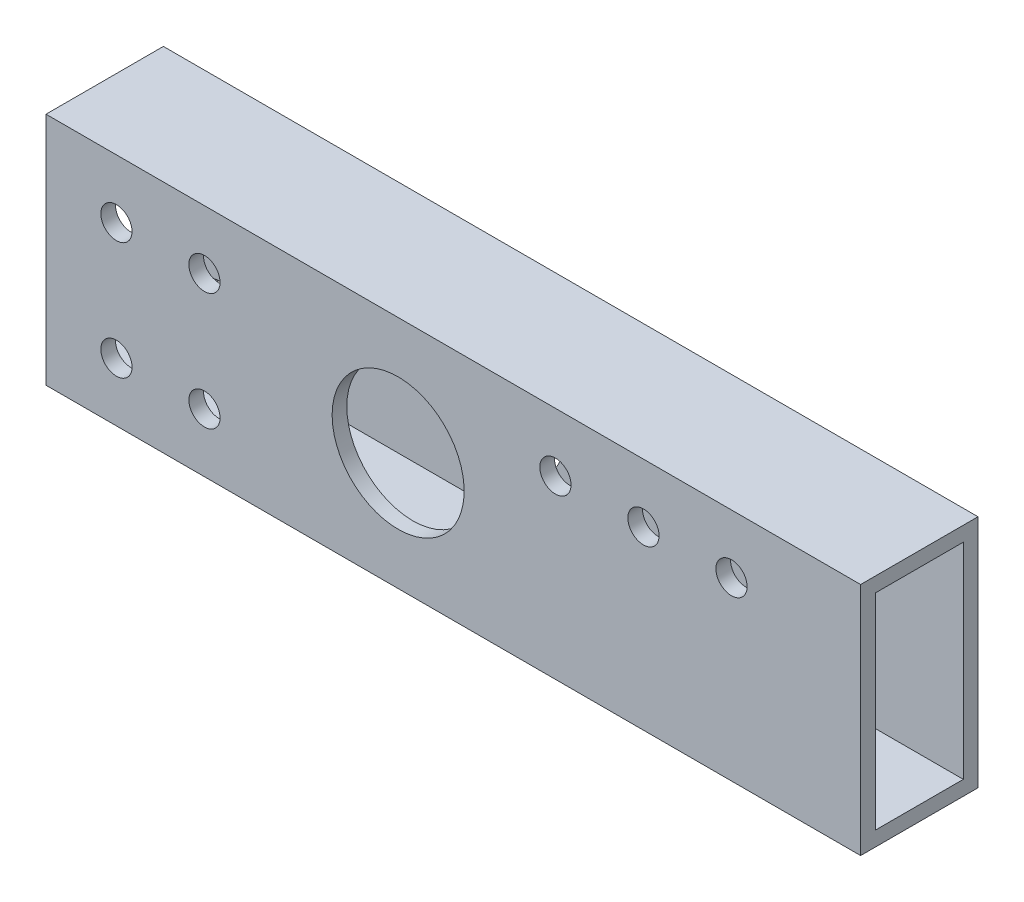
ISO-10303-21;
HEADER;
FILE_DESCRIPTION(('STEP AP214'),'2;1');
FILE_NAME('part.step','',(''),(''),'','','');
FILE_SCHEMA(('AUTOMOTIVE_DESIGN { 1 0 10303 214 1 1 1 1 }'));
ENDSEC;
DATA;
#1=APPLICATION_CONTEXT('core data for automotive mechanical design processes');
#2=APPLICATION_PROTOCOL_DEFINITION('international standard','automotive_design',2000,#1);
#3=PRODUCT_CONTEXT('',#1,'mechanical');
#4=PRODUCT('Part','Part','',(#3));
#5=PRODUCT_RELATED_PRODUCT_CATEGORY('part','',(#4));
#6=PRODUCT_DEFINITION_FORMATION('','',#4);
#7=PRODUCT_DEFINITION_CONTEXT('part definition',#1,'design');
#8=PRODUCT_DEFINITION('design','',#6,#7);
#9=PRODUCT_DEFINITION_SHAPE('','',#8);
#10=(LENGTH_UNIT() NAMED_UNIT(*) SI_UNIT(.MILLI.,.METRE.));
#11=(NAMED_UNIT(*) PLANE_ANGLE_UNIT() SI_UNIT($,.RADIAN.));
#12=(NAMED_UNIT(*) SI_UNIT($,.STERADIAN.) SOLID_ANGLE_UNIT());
#13=UNCERTAINTY_MEASURE_WITH_UNIT(LENGTH_MEASURE(1.E-05),#10,'distance_accuracy_value','');
#14=(GEOMETRIC_REPRESENTATION_CONTEXT(3) GLOBAL_UNCERTAINTY_ASSIGNED_CONTEXT((#13)) GLOBAL_UNIT_ASSIGNED_CONTEXT((#10,
#11,#12)) REPRESENTATION_CONTEXT('',''));
#15=CARTESIAN_POINT('',(0.,0.,0.));
#16=DIRECTION('',(0.,0.,1.));
#17=DIRECTION('',(1.,0.,0.));
#18=AXIS2_PLACEMENT_3D('',#15,#16,#17);
#19=CARTESIAN_POINT('',(0.,50.8,0.));
#20=DIRECTION('',(1.,0.,0.));
#21=DIRECTION('',(0.,0.,-1.));
#22=AXIS2_PLACEMENT_3D('',#19,#20,#21);
#23=PLANE('',#22);
#24=DIRECTION('',(0.,1.,0.));
#25=VECTOR('',#24,1.);
#26=CARTESIAN_POINT('',(0.,47.625,-22.225));
#27=LINE('',#26,#25);
#28=CARTESIAN_POINT('',(0.,3.175,-22.225));
#29=VERTEX_POINT('',#28);
#30=CARTESIAN_POINT('',(0.,47.625,-22.225));
#31=VERTEX_POINT('',#30);
#32=EDGE_CURVE('E108',#29,#31,#27,.T.);
#33=ORIENTED_EDGE('',*,*,#32,.T.);
#34=DIRECTION('',(0.,0.,1.));
#35=VECTOR('',#34,1.);
#36=CARTESIAN_POINT('',(0.,47.625,-3.175));
#37=LINE('',#36,#35);
#38=CARTESIAN_POINT('',(0.,47.625,-3.175));
#39=VERTEX_POINT('',#38);
#40=EDGE_CURVE('E102',#31,#39,#37,.T.);
#41=ORIENTED_EDGE('',*,*,#40,.T.);
#42=DIRECTION('',(0.,-1.,0.));
#43=VECTOR('',#42,1.);
#44=CARTESIAN_POINT('',(0.,47.625,-3.175));
#45=LINE('',#44,#43);
#46=CARTESIAN_POINT('',(0.,3.175,-3.175));
#47=VERTEX_POINT('',#46);
#48=EDGE_CURVE('E111',#39,#47,#45,.T.);
#49=ORIENTED_EDGE('',*,*,#48,.T.);
#50=DIRECTION('',(0.,0.,-1.));
#51=VECTOR('',#50,1.);
#52=CARTESIAN_POINT('',(0.,3.175,-3.175));
#53=LINE('',#52,#51);
#54=EDGE_CURVE('E50',#47,#29,#53,.T.);
#55=ORIENTED_EDGE('',*,*,#54,.T.);
#56=EDGE_LOOP('',(#33,#41,#49,#55));
#57=FACE_BOUND('',#56,.T.);
#58=DIRECTION('',(0.,0.,1.));
#59=VECTOR('',#58,1.);
#60=CARTESIAN_POINT('',(0.,0.,0.));
#61=LINE('',#60,#59);
#62=CARTESIAN_POINT('',(0.,0.,-25.4));
#63=VERTEX_POINT('',#62);
#64=CARTESIAN_POINT('',(0.,0.,0.));
#65=VERTEX_POINT('',#64);
#66=EDGE_CURVE('E135',#63,#65,#61,.T.);
#67=ORIENTED_EDGE('',*,*,#66,.T.);
#68=DIRECTION('',(0.,-1.,0.));
#69=VECTOR('',#68,1.);
#70=CARTESIAN_POINT('',(0.,50.8,0.));
#71=LINE('',#70,#69);
#72=CARTESIAN_POINT('',(0.,50.8,0.));
#73=VERTEX_POINT('',#72);
#74=EDGE_CURVE('E12',#73,#65,#71,.T.);
#75=ORIENTED_EDGE('',*,*,#74,.F.);
#76=DIRECTION('',(0.,0.,1.));
#77=VECTOR('',#76,1.);
#78=CARTESIAN_POINT('',(0.,50.8,0.));
#79=LINE('',#78,#77);
#80=CARTESIAN_POINT('',(0.,50.8,-25.4));
#81=VERTEX_POINT('',#80);
#82=EDGE_CURVE('E139',#81,#73,#79,.T.);
#83=ORIENTED_EDGE('',*,*,#82,.F.);
#84=DIRECTION('',(0.,-1.,0.));
#85=VECTOR('',#84,1.);
#86=CARTESIAN_POINT('',(0.,50.8,-25.4));
#87=LINE('',#86,#85);
#88=EDGE_CURVE('E149',#81,#63,#87,.T.);
#89=ORIENTED_EDGE('',*,*,#88,.T.);
#90=EDGE_LOOP('',(#67,#75,#83,#89));
#91=FACE_BOUND('',#90,.T.);
#92=ADVANCED_FACE('F34',(#57,#91),#23,.F.);
#93=CARTESIAN_POINT('',(0.,50.8,0.));
#94=DIRECTION('',(0.,0.,-1.));
#95=DIRECTION('',(-1.,0.,0.));
#96=AXIS2_PLACEMENT_3D('',#93,#94,#95);
#97=PLANE('',#96);
#98=CARTESIAN_POINT('',(34.29,38.1,0.));
#99=DIRECTION('',(0.,0.,1.));
#100=DIRECTION('',(1.,0.,0.));
#101=AXIS2_PLACEMENT_3D('',#98,#99,#100);
#102=CIRCLE('',#101,3.3782);
#103=CARTESIAN_POINT('',(37.6682,38.1,0.));
#104=VERTEX_POINT('',#103);
#105=EDGE_CURVE('E556',#104,#104,#102,.T.);
#106=ORIENTED_EDGE('',*,*,#105,.F.);
#107=EDGE_LOOP('',(#106));
#108=FACE_BOUND('',#107,.T.);
#109=CARTESIAN_POINT('',(34.29,12.7,0.));
#110=DIRECTION('',(0.,0.,1.));
#111=DIRECTION('',(1.,0.,0.));
#112=AXIS2_PLACEMENT_3D('',#109,#110,#111);
#113=CIRCLE('',#112,3.3782);
#114=CARTESIAN_POINT('',(37.6682,12.7,0.));
#115=VERTEX_POINT('',#114);
#116=EDGE_CURVE('E202',#115,#115,#113,.T.);
#117=ORIENTED_EDGE('',*,*,#116,.F.);
#118=EDGE_LOOP('',(#117));
#119=FACE_BOUND('',#118,.T.);
#120=CARTESIAN_POINT('',(15.24,12.7,0.));
#121=DIRECTION('',(0.,0.,1.));
#122=DIRECTION('',(1.,0.,0.));
#123=AXIS2_PLACEMENT_3D('',#120,#121,#122);
#124=CIRCLE('',#123,3.3782);
#125=CARTESIAN_POINT('',(18.6182,12.7,0.));
#126=VERTEX_POINT('',#125);
#127=EDGE_CURVE('E199',#126,#126,#124,.T.);
#128=ORIENTED_EDGE('',*,*,#127,.F.);
#129=EDGE_LOOP('',(#128));
#130=FACE_BOUND('',#129,.T.);
#131=CARTESIAN_POINT('',(15.24,38.1,0.));
#132=DIRECTION('',(0.,0.,1.));
#133=DIRECTION('',(1.,0.,0.));
#134=AXIS2_PLACEMENT_3D('',#131,#132,#133);
#135=CIRCLE('',#134,3.3782);
#136=CARTESIAN_POINT('',(18.6182,38.1,0.));
#137=VERTEX_POINT('',#136);
#138=EDGE_CURVE('E218',#137,#137,#135,.T.);
#139=ORIENTED_EDGE('',*,*,#138,.F.);
#140=EDGE_LOOP('',(#139));
#141=FACE_BOUND('',#140,.T.);
#142=CARTESIAN_POINT('',(110.236,38.1,0.));
#143=DIRECTION('',(0.,0.,1.));
#144=DIRECTION('',(1.,0.,0.));
#145=AXIS2_PLACEMENT_3D('',#142,#143,#144);
#146=CIRCLE('',#145,3.37819999999999);
#147=CARTESIAN_POINT('',(113.6142,38.1,0.));
#148=VERTEX_POINT('',#147);
#149=EDGE_CURVE('E225',#148,#148,#146,.T.);
#150=ORIENTED_EDGE('',*,*,#149,.F.);
#151=EDGE_LOOP('',(#150));
#152=FACE_BOUND('',#151,.T.);
#153=CARTESIAN_POINT('',(129.286,38.1,0.));
#154=DIRECTION('',(0.,0.,1.));
#155=DIRECTION('',(1.,0.,0.));
#156=AXIS2_PLACEMENT_3D('',#153,#154,#155);
#157=CIRCLE('',#156,3.37819999999999);
#158=CARTESIAN_POINT('',(132.6642,38.1,0.));
#159=VERTEX_POINT('',#158);
#160=EDGE_CURVE('E232',#159,#159,#157,.T.);
#161=ORIENTED_EDGE('',*,*,#160,.F.);
#162=EDGE_LOOP('',(#161));
#163=FACE_BOUND('',#162,.T.);
#164=CARTESIAN_POINT('',(148.336,38.1,0.));
#165=DIRECTION('',(0.,0.,1.));
#166=DIRECTION('',(1.,0.,0.));
#167=AXIS2_PLACEMENT_3D('',#164,#165,#166);
#168=CIRCLE('',#167,3.37819999999999);
#169=CARTESIAN_POINT('',(151.7142,38.1,0.));
#170=VERTEX_POINT('',#169);
#171=EDGE_CURVE('E239',#170,#170,#168,.T.);
#172=ORIENTED_EDGE('',*,*,#171,.F.);
#173=EDGE_LOOP('',(#172));
#174=FACE_BOUND('',#173,.T.);
#175=CARTESIAN_POINT('',(76.2,25.4,0.));
#176=DIRECTION('',(0.,0.,-1.));
#177=DIRECTION('',(-1.,0.,0.));
#178=AXIS2_PLACEMENT_3D('',#175,#176,#177);
#179=CIRCLE('',#178,14.2875);
#180=CARTESIAN_POINT('',(61.9125,25.4,0.));
#181=VERTEX_POINT('',#180);
#182=EDGE_CURVE('E167',#181,#181,#179,.T.);
#183=ORIENTED_EDGE('',*,*,#182,.T.);
#184=EDGE_LOOP('',(#183));
#185=FACE_BOUND('',#184,.T.);
#186=DIRECTION('',(1.,0.,0.));
#187=VECTOR('',#186,1.);
#188=CARTESIAN_POINT('',(0.,0.,0.));
#189=LINE('',#188,#187);
#190=CARTESIAN_POINT('',(176.276,0.,0.));
#191=VERTEX_POINT('',#190);
#192=EDGE_CURVE('E152',#65,#191,#189,.T.);
#193=ORIENTED_EDGE('',*,*,#192,.T.);
#194=DIRECTION('',(0.,-1.,0.));
#195=VECTOR('',#194,1.);
#196=CARTESIAN_POINT('',(176.276,50.8,0.));
#197=LINE('',#196,#195);
#198=CARTESIAN_POINT('',(176.276,50.8,0.));
#199=VERTEX_POINT('',#198);
#200=EDGE_CURVE('E42',#199,#191,#197,.T.);
#201=ORIENTED_EDGE('',*,*,#200,.F.);
#202=DIRECTION('',(1.,0.,0.));
#203=VECTOR('',#202,1.);
#204=CARTESIAN_POINT('',(0.,50.8,0.));
#205=LINE('',#204,#203);
#206=EDGE_CURVE('E142',#73,#199,#205,.T.);
#207=ORIENTED_EDGE('',*,*,#206,.F.);
#208=ORIENTED_EDGE('',*,*,#74,.T.);
#209=EDGE_LOOP('',(#193,#201,#207,#208));
#210=FACE_BOUND('',#209,.T.);
#211=ADVANCED_FACE('F273',(#108,#119,#130,#141,#152,#163,#174,#185,#210),#97,.F.);
#212=CARTESIAN_POINT('',(176.276,50.8,0.));
#213=DIRECTION('',(-1.,0.,0.));
#214=DIRECTION('',(0.,0.,1.));
#215=AXIS2_PLACEMENT_3D('',#212,#213,#214);
#216=PLANE('',#215);
#217=DIRECTION('',(0.,-1.,0.));
#218=VECTOR('',#217,1.);
#219=CARTESIAN_POINT('',(176.276,47.625,-3.175));
#220=LINE('',#219,#218);
#221=CARTESIAN_POINT('',(176.276,47.625,-3.175));
#222=VERTEX_POINT('',#221);
#223=CARTESIAN_POINT('',(176.276,3.175,-3.175));
#224=VERTEX_POINT('',#223);
#225=EDGE_CURVE('E129',#222,#224,#220,.T.);
#226=ORIENTED_EDGE('',*,*,#225,.F.);
#227=DIRECTION('',(0.,0.,1.));
#228=VECTOR('',#227,1.);
#229=CARTESIAN_POINT('',(176.276,47.625,-3.175));
#230=LINE('',#229,#228);
#231=CARTESIAN_POINT('',(176.276,47.625,-22.225));
#232=VERTEX_POINT('',#231);
#233=EDGE_CURVE('E58',#232,#222,#230,.T.);
#234=ORIENTED_EDGE('',*,*,#233,.F.);
#235=DIRECTION('',(0.,1.,0.));
#236=VECTOR('',#235,1.);
#237=CARTESIAN_POINT('',(176.276,47.625,-22.225));
#238=LINE('',#237,#236);
#239=CARTESIAN_POINT('',(176.276,3.175,-22.225));
#240=VERTEX_POINT('',#239);
#241=EDGE_CURVE('E117',#240,#232,#238,.T.);
#242=ORIENTED_EDGE('',*,*,#241,.F.);
#243=DIRECTION('',(0.,0.,-1.));
#244=VECTOR('',#243,1.);
#245=CARTESIAN_POINT('',(176.276,3.175,-3.175));
#246=LINE('',#245,#244);
#247=EDGE_CURVE('E120',#224,#240,#246,.T.);
#248=ORIENTED_EDGE('',*,*,#247,.F.);
#249=EDGE_LOOP('',(#226,#234,#242,#248));
#250=FACE_BOUND('',#249,.T.);
#251=DIRECTION('',(0.,0.,-1.));
#252=VECTOR('',#251,1.);
#253=CARTESIAN_POINT('',(176.276,0.,0.));
#254=LINE('',#253,#252);
#255=CARTESIAN_POINT('',(176.276,0.,-25.4));
#256=VERTEX_POINT('',#255);
#257=EDGE_CURVE('E154',#191,#256,#254,.T.);
#258=ORIENTED_EDGE('',*,*,#257,.T.);
#259=DIRECTION('',(0.,-1.,0.));
#260=VECTOR('',#259,1.);
#261=CARTESIAN_POINT('',(176.276,50.8,-25.4));
#262=LINE('',#261,#260);
#263=CARTESIAN_POINT('',(176.276,50.8,-25.4));
#264=VERTEX_POINT('',#263);
#265=EDGE_CURVE('E159',#264,#256,#262,.T.);
#266=ORIENTED_EDGE('',*,*,#265,.F.);
#267=DIRECTION('',(0.,0.,-1.));
#268=VECTOR('',#267,1.);
#269=CARTESIAN_POINT('',(176.276,50.8,0.));
#270=LINE('',#269,#268);
#271=EDGE_CURVE('E145',#199,#264,#270,.T.);
#272=ORIENTED_EDGE('',*,*,#271,.F.);
#273=ORIENTED_EDGE('',*,*,#200,.T.);
#274=EDGE_LOOP('',(#258,#266,#272,#273));
#275=FACE_BOUND('',#274,.T.);
#276=ADVANCED_FACE('F258',(#250,#275),#216,.F.);
#277=CARTESIAN_POINT('',(0.,50.8,-25.4));
#278=DIRECTION('',(0.,0.,1.));
#279=DIRECTION('',(1.,0.,0.));
#280=AXIS2_PLACEMENT_3D('',#277,#278,#279);
#281=PLANE('',#280);
#282=CARTESIAN_POINT('',(34.29,38.1,-25.4));
#283=DIRECTION('',(0.,0.,1.));
#284=DIRECTION('',(1.,0.,0.));
#285=AXIS2_PLACEMENT_3D('',#282,#283,#284);
#286=CIRCLE('',#285,3.3782);
#287=CARTESIAN_POINT('',(37.6682,38.1,-25.4));
#288=VERTEX_POINT('',#287);
#289=EDGE_CURVE('E551',#288,#288,#286,.T.);
#290=ORIENTED_EDGE('',*,*,#289,.T.);
#291=EDGE_LOOP('',(#290));
#292=FACE_BOUND('',#291,.T.);
#293=CARTESIAN_POINT('',(34.29,12.7,-25.4));
#294=DIRECTION('',(0.,0.,1.));
#295=DIRECTION('',(1.,0.,0.));
#296=AXIS2_PLACEMENT_3D('',#293,#294,#295);
#297=CIRCLE('',#296,3.3782);
#298=CARTESIAN_POINT('',(37.6682,12.7,-25.4));
#299=VERTEX_POINT('',#298);
#300=EDGE_CURVE('E195',#299,#299,#297,.T.);
#301=ORIENTED_EDGE('',*,*,#300,.T.);
#302=EDGE_LOOP('',(#301));
#303=FACE_BOUND('',#302,.T.);
#304=CARTESIAN_POINT('',(15.24,12.7,-25.4));
#305=DIRECTION('',(0.,0.,1.));
#306=DIRECTION('',(1.,0.,0.));
#307=AXIS2_PLACEMENT_3D('',#304,#305,#306);
#308=CIRCLE('',#307,3.3782);
#309=CARTESIAN_POINT('',(18.6182,12.7,-25.4));
#310=VERTEX_POINT('',#309);
#311=EDGE_CURVE('E191',#310,#310,#308,.T.);
#312=ORIENTED_EDGE('',*,*,#311,.T.);
#313=EDGE_LOOP('',(#312));
#314=FACE_BOUND('',#313,.T.);
#315=CARTESIAN_POINT('',(15.24,38.1,-25.4));
#316=DIRECTION('',(0.,0.,1.));
#317=DIRECTION('',(1.,0.,0.));
#318=AXIS2_PLACEMENT_3D('',#315,#316,#317);
#319=CIRCLE('',#318,3.3782);
#320=CARTESIAN_POINT('',(18.6182,38.1,-25.4));
#321=VERTEX_POINT('',#320);
#322=EDGE_CURVE('E187',#321,#321,#319,.T.);
#323=ORIENTED_EDGE('',*,*,#322,.T.);
#324=EDGE_LOOP('',(#323));
#325=FACE_BOUND('',#324,.T.);
#326=CARTESIAN_POINT('',(110.236,38.1,-25.4));
#327=DIRECTION('',(0.,0.,1.));
#328=DIRECTION('',(1.,0.,0.));
#329=AXIS2_PLACEMENT_3D('',#326,#327,#328);
#330=CIRCLE('',#329,3.37819999999999);
#331=CARTESIAN_POINT('',(113.6142,38.1,-25.4));
#332=VERTEX_POINT('',#331);
#333=EDGE_CURVE('E182',#332,#332,#330,.T.);
#334=ORIENTED_EDGE('',*,*,#333,.T.);
#335=EDGE_LOOP('',(#334));
#336=FACE_BOUND('',#335,.T.);
#337=CARTESIAN_POINT('',(129.286,38.1,-25.4));
#338=DIRECTION('',(0.,0.,1.));
#339=DIRECTION('',(1.,0.,0.));
#340=AXIS2_PLACEMENT_3D('',#337,#338,#339);
#341=CIRCLE('',#340,3.37819999999999);
#342=CARTESIAN_POINT('',(132.6642,38.1,-25.4));
#343=VERTEX_POINT('',#342);
#344=EDGE_CURVE('E177',#343,#343,#341,.T.);
#345=ORIENTED_EDGE('',*,*,#344,.T.);
#346=EDGE_LOOP('',(#345));
#347=FACE_BOUND('',#346,.T.);
#348=CARTESIAN_POINT('',(148.336,38.1,-25.4));
#349=DIRECTION('',(0.,0.,1.));
#350=DIRECTION('',(1.,0.,0.));
#351=AXIS2_PLACEMENT_3D('',#348,#349,#350);
#352=CIRCLE('',#351,3.37819999999999);
#353=CARTESIAN_POINT('',(151.7142,38.1,-25.4));
#354=VERTEX_POINT('',#353);
#355=EDGE_CURVE('E172',#354,#354,#352,.T.);
#356=ORIENTED_EDGE('',*,*,#355,.T.);
#357=EDGE_LOOP('',(#356));
#358=FACE_BOUND('',#357,.T.);
#359=CARTESIAN_POINT('',(76.2,25.4,-25.4));
#360=DIRECTION('',(0.,0.,-1.));
#361=DIRECTION('',(-1.,0.,0.));
#362=AXIS2_PLACEMENT_3D('',#359,#360,#361);
#363=CIRCLE('',#362,14.2875);
#364=CARTESIAN_POINT('',(61.9125,25.4,-25.4));
#365=VERTEX_POINT('',#364);
#366=EDGE_CURVE('E246',#365,#365,#363,.T.);
#367=ORIENTED_EDGE('',*,*,#366,.F.);
#368=EDGE_LOOP('',(#367));
#369=FACE_BOUND('',#368,.T.);
#370=DIRECTION('',(-1.,0.,0.));
#371=VECTOR('',#370,1.);
#372=CARTESIAN_POINT('',(0.,0.,-25.4));
#373=LINE('',#372,#371);
#374=EDGE_CURVE('E143',#256,#63,#373,.T.);
#375=ORIENTED_EDGE('',*,*,#374,.T.);
#376=ORIENTED_EDGE('',*,*,#88,.F.);
#377=DIRECTION('',(-1.,0.,0.));
#378=VECTOR('',#377,1.);
#379=CARTESIAN_POINT('',(0.,50.8,-25.4));
#380=LINE('',#379,#378);
#381=EDGE_CURVE('E147',#264,#81,#380,.T.);
#382=ORIENTED_EDGE('',*,*,#381,.F.);
#383=ORIENTED_EDGE('',*,*,#265,.T.);
#384=EDGE_LOOP('',(#375,#376,#382,#383));
#385=FACE_BOUND('',#384,.T.);
#386=ADVANCED_FACE('F254',(#292,#303,#314,#325,#336,#347,#358,#369,#385),#281,.F.);
#387=CARTESIAN_POINT('',(0.,50.8,0.));
#388=DIRECTION('',(0.,-1.,0.));
#389=DIRECTION('',(0.,0.,-1.));
#390=AXIS2_PLACEMENT_3D('',#387,#388,#389);
#391=PLANE('',#390);
#392=ORIENTED_EDGE('',*,*,#82,.T.);
#393=ORIENTED_EDGE('',*,*,#206,.T.);
#394=ORIENTED_EDGE('',*,*,#271,.T.);
#395=ORIENTED_EDGE('',*,*,#381,.T.);
#396=EDGE_LOOP('',(#392,#393,#394,#395));
#397=FACE_BOUND('',#396,.T.);
#398=ADVANCED_FACE('F257',(#397),#391,.F.);
#399=CARTESIAN_POINT('',(0.,0.,0.));
#400=DIRECTION('',(0.,-1.,0.));
#401=DIRECTION('',(0.,0.,-1.));
#402=AXIS2_PLACEMENT_3D('',#399,#400,#401);
#403=PLANE('',#402);
#404=ORIENTED_EDGE('',*,*,#66,.F.);
#405=ORIENTED_EDGE('',*,*,#374,.F.);
#406=ORIENTED_EDGE('',*,*,#257,.F.);
#407=ORIENTED_EDGE('',*,*,#192,.F.);
#408=EDGE_LOOP('',(#404,#405,#406,#407));
#409=FACE_BOUND('',#408,.T.);
#410=ADVANCED_FACE('F270',(#409),#403,.T.);
#411=CARTESIAN_POINT('',(0.,47.625,-3.175));
#412=DIRECTION('',(0.,1.,0.));
#413=DIRECTION('',(0.,0.,1.));
#414=AXIS2_PLACEMENT_3D('',#411,#412,#413);
#415=PLANE('',#414);
#416=ORIENTED_EDGE('',*,*,#233,.T.);
#417=DIRECTION('',(1.,0.,0.));
#418=VECTOR('',#417,1.);
#419=CARTESIAN_POINT('',(0.,47.625,-3.175));
#420=LINE('',#419,#418);
#421=EDGE_CURVE('E98',#39,#222,#420,.T.);
#422=ORIENTED_EDGE('',*,*,#421,.F.);
#423=ORIENTED_EDGE('',*,*,#40,.F.);
#424=DIRECTION('',(1.,0.,0.));
#425=VECTOR('',#424,1.);
#426=CARTESIAN_POINT('',(0.,47.625,-22.225));
#427=LINE('',#426,#425);
#428=EDGE_CURVE('E133',#31,#232,#427,.T.);
#429=ORIENTED_EDGE('',*,*,#428,.T.);
#430=EDGE_LOOP('',(#416,#422,#423,#429));
#431=FACE_BOUND('',#430,.T.);
#432=ADVANCED_FACE('F100',(#431),#415,.F.);
#433=CARTESIAN_POINT('',(0.,47.625,-22.225));
#434=DIRECTION('',(0.,0.,-1.));
#435=DIRECTION('',(-1.,0.,0.));
#436=AXIS2_PLACEMENT_3D('',#433,#434,#435);
#437=PLANE('',#436);
#438=CARTESIAN_POINT('',(34.29,38.1,-22.225));
#439=DIRECTION('',(0.,0.,-1.));
#440=DIRECTION('',(-1.,0.,0.));
#441=AXIS2_PLACEMENT_3D('',#438,#439,#440);
#442=CIRCLE('',#441,3.3782);
#443=CARTESIAN_POINT('',(30.9118,38.1,-22.225));
#444=VERTEX_POINT('',#443);
#445=EDGE_CURVE('E207',#444,#444,#442,.T.);
#446=ORIENTED_EDGE('',*,*,#445,.T.);
#447=EDGE_LOOP('',(#446));
#448=FACE_BOUND('',#447,.T.);
#449=CARTESIAN_POINT('',(34.29,12.7,-22.225));
#450=DIRECTION('',(0.,0.,-1.));
#451=DIRECTION('',(-1.,0.,0.));
#452=AXIS2_PLACEMENT_3D('',#449,#450,#451);
#453=CIRCLE('',#452,3.3782);
#454=CARTESIAN_POINT('',(30.9118,12.7,-22.225));
#455=VERTEX_POINT('',#454);
#456=EDGE_CURVE('E194',#455,#455,#453,.T.);
#457=ORIENTED_EDGE('',*,*,#456,.T.);
#458=EDGE_LOOP('',(#457));
#459=FACE_BOUND('',#458,.T.);
#460=CARTESIAN_POINT('',(15.24,12.7,-22.225));
#461=DIRECTION('',(0.,0.,-1.));
#462=DIRECTION('',(-1.,0.,0.));
#463=AXIS2_PLACEMENT_3D('',#460,#461,#462);
#464=CIRCLE('',#463,3.3782);
#465=CARTESIAN_POINT('',(11.8618,12.7,-22.225));
#466=VERTEX_POINT('',#465);
#467=EDGE_CURVE('E190',#466,#466,#464,.T.);
#468=ORIENTED_EDGE('',*,*,#467,.T.);
#469=EDGE_LOOP('',(#468));
#470=FACE_BOUND('',#469,.T.);
#471=CARTESIAN_POINT('',(15.24,38.1,-22.225));
#472=DIRECTION('',(0.,0.,-1.));
#473=DIRECTION('',(-1.,0.,0.));
#474=AXIS2_PLACEMENT_3D('',#471,#472,#473);
#475=CIRCLE('',#474,3.3782);
#476=CARTESIAN_POINT('',(11.8618,38.1,-22.225));
#477=VERTEX_POINT('',#476);
#478=EDGE_CURVE('E186',#477,#477,#475,.T.);
#479=ORIENTED_EDGE('',*,*,#478,.T.);
#480=EDGE_LOOP('',(#479));
#481=FACE_BOUND('',#480,.T.);
#482=CARTESIAN_POINT('',(110.236,38.1,-22.225));
#483=DIRECTION('',(0.,0.,-1.));
#484=DIRECTION('',(-1.,0.,0.));
#485=AXIS2_PLACEMENT_3D('',#482,#483,#484);
#486=CIRCLE('',#485,3.37819999999999);
#487=CARTESIAN_POINT('',(106.8578,38.1,-22.225));
#488=VERTEX_POINT('',#487);
#489=EDGE_CURVE('E181',#488,#488,#486,.T.);
#490=ORIENTED_EDGE('',*,*,#489,.T.);
#491=EDGE_LOOP('',(#490));
#492=FACE_BOUND('',#491,.T.);
#493=CARTESIAN_POINT('',(129.286,38.1,-22.225));
#494=DIRECTION('',(0.,0.,-1.));
#495=DIRECTION('',(-1.,0.,0.));
#496=AXIS2_PLACEMENT_3D('',#493,#494,#495);
#497=CIRCLE('',#496,3.37819999999999);
#498=CARTESIAN_POINT('',(125.9078,38.1,-22.225));
#499=VERTEX_POINT('',#498);
#500=EDGE_CURVE('E176',#499,#499,#497,.T.);
#501=ORIENTED_EDGE('',*,*,#500,.T.);
#502=EDGE_LOOP('',(#501));
#503=FACE_BOUND('',#502,.T.);
#504=CARTESIAN_POINT('',(148.336,38.1,-22.225));
#505=DIRECTION('',(0.,0.,-1.));
#506=DIRECTION('',(-1.,0.,0.));
#507=AXIS2_PLACEMENT_3D('',#504,#505,#506);
#508=CIRCLE('',#507,3.37819999999999);
#509=CARTESIAN_POINT('',(144.9578,38.1,-22.225));
#510=VERTEX_POINT('',#509);
#511=EDGE_CURVE('E171',#510,#510,#508,.T.);
#512=ORIENTED_EDGE('',*,*,#511,.T.);
#513=EDGE_LOOP('',(#512));
#514=FACE_BOUND('',#513,.T.);
#515=CARTESIAN_POINT('',(76.2,25.4,-22.225));
#516=DIRECTION('',(0.,0.,-1.));
#517=DIRECTION('',(-1.,0.,0.));
#518=AXIS2_PLACEMENT_3D('',#515,#516,#517);
#519=CIRCLE('',#518,14.2875);
#520=CARTESIAN_POINT('',(61.9125,25.4,-22.225));
#521=VERTEX_POINT('',#520);
#522=EDGE_CURVE('E123',#521,#521,#519,.T.);
#523=ORIENTED_EDGE('',*,*,#522,.T.);
#524=EDGE_LOOP('',(#523));
#525=FACE_BOUND('',#524,.T.);
#526=ORIENTED_EDGE('',*,*,#241,.T.);
#527=ORIENTED_EDGE('',*,*,#428,.F.);
#528=ORIENTED_EDGE('',*,*,#32,.F.);
#529=DIRECTION('',(1.,0.,0.));
#530=VECTOR('',#529,1.);
#531=CARTESIAN_POINT('',(0.,3.175,-22.225));
#532=LINE('',#531,#530);
#533=EDGE_CURVE('E136',#29,#240,#532,.T.);
#534=ORIENTED_EDGE('',*,*,#533,.T.);
#535=EDGE_LOOP('',(#526,#527,#528,#534));
#536=FACE_BOUND('',#535,.T.);
#537=ADVANCED_FACE('F312',(#448,#459,#470,#481,#492,#503,#514,#525,#536),#437,.F.);
#538=CARTESIAN_POINT('',(0.,3.175,-3.175));
#539=DIRECTION('',(0.,-1.,0.));
#540=DIRECTION('',(0.,0.,-1.));
#541=AXIS2_PLACEMENT_3D('',#538,#539,#540);
#542=PLANE('',#541);
#543=ORIENTED_EDGE('',*,*,#247,.T.);
#544=ORIENTED_EDGE('',*,*,#533,.F.);
#545=ORIENTED_EDGE('',*,*,#54,.F.);
#546=DIRECTION('',(1.,0.,0.));
#547=VECTOR('',#546,1.);
#548=CARTESIAN_POINT('',(0.,3.175,-3.175));
#549=LINE('',#548,#547);
#550=EDGE_CURVE('E107',#47,#224,#549,.T.);
#551=ORIENTED_EDGE('',*,*,#550,.T.);
#552=EDGE_LOOP('',(#543,#544,#545,#551));
#553=FACE_BOUND('',#552,.T.);
#554=ADVANCED_FACE('F317',(#553),#542,.F.);
#555=CARTESIAN_POINT('',(0.,47.625,-3.175));
#556=DIRECTION('',(0.,0.,1.));
#557=DIRECTION('',(1.,0.,0.));
#558=AXIS2_PLACEMENT_3D('',#555,#556,#557);
#559=PLANE('',#558);
#560=CARTESIAN_POINT('',(34.29,38.1,-3.175));
#561=DIRECTION('',(0.,0.,1.));
#562=DIRECTION('',(1.,0.,0.));
#563=AXIS2_PLACEMENT_3D('',#560,#561,#562);
#564=CIRCLE('',#563,3.3782);
#565=CARTESIAN_POINT('',(37.6682,38.1,-3.175));
#566=VERTEX_POINT('',#565);
#567=EDGE_CURVE('E37',#566,#566,#564,.T.);
#568=ORIENTED_EDGE('',*,*,#567,.T.);
#569=EDGE_LOOP('',(#568));
#570=FACE_BOUND('',#569,.T.);
#571=CARTESIAN_POINT('',(34.29,12.7,-3.175));
#572=DIRECTION('',(0.,0.,1.));
#573=DIRECTION('',(1.,0.,0.));
#574=AXIS2_PLACEMENT_3D('',#571,#572,#573);
#575=CIRCLE('',#574,3.3782);
#576=CARTESIAN_POINT('',(37.6682,12.7,-3.175));
#577=VERTEX_POINT('',#576);
#578=EDGE_CURVE('E192',#577,#577,#575,.T.);
#579=ORIENTED_EDGE('',*,*,#578,.T.);
#580=EDGE_LOOP('',(#579));
#581=FACE_BOUND('',#580,.T.);
#582=CARTESIAN_POINT('',(15.24,12.7,-3.175));
#583=DIRECTION('',(0.,0.,1.));
#584=DIRECTION('',(1.,0.,0.));
#585=AXIS2_PLACEMENT_3D('',#582,#583,#584);
#586=CIRCLE('',#585,3.3782);
#587=CARTESIAN_POINT('',(18.6182,12.7,-3.175));
#588=VERTEX_POINT('',#587);
#589=EDGE_CURVE('E188',#588,#588,#586,.T.);
#590=ORIENTED_EDGE('',*,*,#589,.T.);
#591=EDGE_LOOP('',(#590));
#592=FACE_BOUND('',#591,.T.);
#593=CARTESIAN_POINT('',(15.24,38.1,-3.175));
#594=DIRECTION('',(0.,0.,1.));
#595=DIRECTION('',(1.,0.,0.));
#596=AXIS2_PLACEMENT_3D('',#593,#594,#595);
#597=CIRCLE('',#596,3.3782);
#598=CARTESIAN_POINT('',(18.6182,38.1,-3.175));
#599=VERTEX_POINT('',#598);
#600=EDGE_CURVE('E183',#599,#599,#597,.T.);
#601=ORIENTED_EDGE('',*,*,#600,.T.);
#602=EDGE_LOOP('',(#601));
#603=FACE_BOUND('',#602,.T.);
#604=CARTESIAN_POINT('',(110.236,38.1,-3.175));
#605=DIRECTION('',(0.,0.,1.));
#606=DIRECTION('',(1.,0.,0.));
#607=AXIS2_PLACEMENT_3D('',#604,#605,#606);
#608=CIRCLE('',#607,3.37819999999999);
#609=CARTESIAN_POINT('',(113.6142,38.1,-3.175));
#610=VERTEX_POINT('',#609);
#611=EDGE_CURVE('E178',#610,#610,#608,.T.);
#612=ORIENTED_EDGE('',*,*,#611,.T.);
#613=EDGE_LOOP('',(#612));
#614=FACE_BOUND('',#613,.T.);
#615=CARTESIAN_POINT('',(129.286,38.1,-3.175));
#616=DIRECTION('',(0.,0.,1.));
#617=DIRECTION('',(1.,0.,0.));
#618=AXIS2_PLACEMENT_3D('',#615,#616,#617);
#619=CIRCLE('',#618,3.37819999999999);
#620=CARTESIAN_POINT('',(132.6642,38.1,-3.175));
#621=VERTEX_POINT('',#620);
#622=EDGE_CURVE('E173',#621,#621,#619,.T.);
#623=ORIENTED_EDGE('',*,*,#622,.T.);
#624=EDGE_LOOP('',(#623));
#625=FACE_BOUND('',#624,.T.);
#626=CARTESIAN_POINT('',(148.336,38.1,-3.175));
#627=DIRECTION('',(0.,0.,1.));
#628=DIRECTION('',(1.,0.,0.));
#629=AXIS2_PLACEMENT_3D('',#626,#627,#628);
#630=CIRCLE('',#629,3.37819999999999);
#631=CARTESIAN_POINT('',(151.7142,38.1,-3.175));
#632=VERTEX_POINT('',#631);
#633=EDGE_CURVE('E168',#632,#632,#630,.T.);
#634=ORIENTED_EDGE('',*,*,#633,.T.);
#635=EDGE_LOOP('',(#634));
#636=FACE_BOUND('',#635,.T.);
#637=CARTESIAN_POINT('',(76.2,25.4,-3.175));
#638=DIRECTION('',(0.,0.,1.));
#639=DIRECTION('',(1.,0.,0.));
#640=AXIS2_PLACEMENT_3D('',#637,#638,#639);
#641=CIRCLE('',#640,14.2875);
#642=CARTESIAN_POINT('',(90.4875,25.4,-3.175));
#643=VERTEX_POINT('',#642);
#644=EDGE_CURVE('E164',#643,#643,#641,.T.);
#645=ORIENTED_EDGE('',*,*,#644,.T.);
#646=EDGE_LOOP('',(#645));
#647=FACE_BOUND('',#646,.T.);
#648=ORIENTED_EDGE('',*,*,#225,.T.);
#649=ORIENTED_EDGE('',*,*,#550,.F.);
#650=ORIENTED_EDGE('',*,*,#48,.F.);
#651=ORIENTED_EDGE('',*,*,#421,.T.);
#652=EDGE_LOOP('',(#648,#649,#650,#651));
#653=FACE_BOUND('',#652,.T.);
#654=ADVANCED_FACE('F112',(#570,#581,#592,#603,#614,#625,#636,#647,#653),#559,.F.);
#655=CARTESIAN_POINT('',(76.2,25.4,0.));
#656=DIRECTION('',(0.,0.,-1.));
#657=DIRECTION('',(-1.,0.,0.));
#658=AXIS2_PLACEMENT_3D('',#655,#656,#657);
#659=CYLINDRICAL_SURFACE('',#658,14.2875);
#660=ORIENTED_EDGE('',*,*,#182,.F.);
#661=EDGE_LOOP('',(#660));
#662=FACE_BOUND('',#661,.T.);
#663=ORIENTED_EDGE('',*,*,#644,.F.);
#664=EDGE_LOOP('',(#663));
#665=FACE_BOUND('',#664,.T.);
#666=ADVANCED_FACE('F331',(#662,#665),#659,.F.);
#667=ORIENTED_EDGE('',*,*,#366,.T.);
#668=EDGE_LOOP('',(#667));
#669=FACE_BOUND('',#668,.T.);
#670=ORIENTED_EDGE('',*,*,#522,.F.);
#671=EDGE_LOOP('',(#670));
#672=FACE_BOUND('',#671,.T.);
#673=ADVANCED_FACE('F251',(#669,#672),#659,.F.);
#674=CARTESIAN_POINT('',(148.336,38.1,-25.4));
#675=DIRECTION('',(0.,0.,1.));
#676=DIRECTION('',(1.,0.,0.));
#677=AXIS2_PLACEMENT_3D('',#674,#675,#676);
#678=CYLINDRICAL_SURFACE('',#677,3.37819999999999);
#679=ORIENTED_EDGE('',*,*,#171,.T.);
#680=EDGE_LOOP('',(#679));
#681=FACE_BOUND('',#680,.T.);
#682=ORIENTED_EDGE('',*,*,#633,.F.);
#683=EDGE_LOOP('',(#682));
#684=FACE_BOUND('',#683,.T.);
#685=ADVANCED_FACE('F428',(#681,#684),#678,.F.);
#686=ORIENTED_EDGE('',*,*,#355,.F.);
#687=EDGE_LOOP('',(#686));
#688=FACE_BOUND('',#687,.T.);
#689=ORIENTED_EDGE('',*,*,#511,.F.);
#690=EDGE_LOOP('',(#689));
#691=FACE_BOUND('',#690,.T.);
#692=ADVANCED_FACE('F425',(#688,#691),#678,.F.);
#693=CARTESIAN_POINT('',(129.286,38.1,-25.4));
#694=DIRECTION('',(0.,0.,1.));
#695=DIRECTION('',(1.,0.,0.));
#696=AXIS2_PLACEMENT_3D('',#693,#694,#695);
#697=CYLINDRICAL_SURFACE('',#696,3.37819999999999);
#698=ORIENTED_EDGE('',*,*,#160,.T.);
#699=EDGE_LOOP('',(#698));
#700=FACE_BOUND('',#699,.T.);
#701=ORIENTED_EDGE('',*,*,#622,.F.);
#702=EDGE_LOOP('',(#701));
#703=FACE_BOUND('',#702,.T.);
#704=ADVANCED_FACE('F423',(#700,#703),#697,.F.);
#705=ORIENTED_EDGE('',*,*,#344,.F.);
#706=EDGE_LOOP('',(#705));
#707=FACE_BOUND('',#706,.T.);
#708=ORIENTED_EDGE('',*,*,#500,.F.);
#709=EDGE_LOOP('',(#708));
#710=FACE_BOUND('',#709,.T.);
#711=ADVANCED_FACE('F420',(#707,#710),#697,.F.);
#712=CARTESIAN_POINT('',(110.236,38.1,-25.4));
#713=DIRECTION('',(0.,0.,1.));
#714=DIRECTION('',(1.,0.,0.));
#715=AXIS2_PLACEMENT_3D('',#712,#713,#714);
#716=CYLINDRICAL_SURFACE('',#715,3.37819999999999);
#717=ORIENTED_EDGE('',*,*,#149,.T.);
#718=EDGE_LOOP('',(#717));
#719=FACE_BOUND('',#718,.T.);
#720=ORIENTED_EDGE('',*,*,#611,.F.);
#721=EDGE_LOOP('',(#720));
#722=FACE_BOUND('',#721,.T.);
#723=ADVANCED_FACE('F418',(#719,#722),#716,.F.);
#724=ORIENTED_EDGE('',*,*,#333,.F.);
#725=EDGE_LOOP('',(#724));
#726=FACE_BOUND('',#725,.T.);
#727=ORIENTED_EDGE('',*,*,#489,.F.);
#728=EDGE_LOOP('',(#727));
#729=FACE_BOUND('',#728,.T.);
#730=ADVANCED_FACE('F299',(#726,#729),#716,.F.);
#731=CARTESIAN_POINT('',(15.24,38.1,-25.4));
#732=DIRECTION('',(0.,0.,1.));
#733=DIRECTION('',(1.,0.,0.));
#734=AXIS2_PLACEMENT_3D('',#731,#732,#733);
#735=CYLINDRICAL_SURFACE('',#734,3.3782);
#736=ORIENTED_EDGE('',*,*,#138,.T.);
#737=EDGE_LOOP('',(#736));
#738=FACE_BOUND('',#737,.T.);
#739=ORIENTED_EDGE('',*,*,#600,.F.);
#740=EDGE_LOOP('',(#739));
#741=FACE_BOUND('',#740,.T.);
#742=ADVANCED_FACE('F339',(#738,#741),#735,.F.);
#743=ORIENTED_EDGE('',*,*,#322,.F.);
#744=EDGE_LOOP('',(#743));
#745=FACE_BOUND('',#744,.T.);
#746=ORIENTED_EDGE('',*,*,#478,.F.);
#747=EDGE_LOOP('',(#746));
#748=FACE_BOUND('',#747,.T.);
#749=ADVANCED_FACE('F344',(#745,#748),#735,.F.);
#750=CARTESIAN_POINT('',(15.24,12.7,-25.4));
#751=DIRECTION('',(0.,0.,1.));
#752=DIRECTION('',(1.,0.,0.));
#753=AXIS2_PLACEMENT_3D('',#750,#751,#752);
#754=CYLINDRICAL_SURFACE('',#753,3.3782);
#755=ORIENTED_EDGE('',*,*,#127,.T.);
#756=EDGE_LOOP('',(#755));
#757=FACE_BOUND('',#756,.T.);
#758=ORIENTED_EDGE('',*,*,#589,.F.);
#759=EDGE_LOOP('',(#758));
#760=FACE_BOUND('',#759,.T.);
#761=ADVANCED_FACE('F354',(#757,#760),#754,.F.);
#762=ORIENTED_EDGE('',*,*,#311,.F.);
#763=EDGE_LOOP('',(#762));
#764=FACE_BOUND('',#763,.T.);
#765=ORIENTED_EDGE('',*,*,#467,.F.);
#766=EDGE_LOOP('',(#765));
#767=FACE_BOUND('',#766,.T.);
#768=ADVANCED_FACE('F363',(#764,#767),#754,.F.);
#769=CARTESIAN_POINT('',(34.29,12.7,-25.4));
#770=DIRECTION('',(0.,0.,1.));
#771=DIRECTION('',(1.,0.,0.));
#772=AXIS2_PLACEMENT_3D('',#769,#770,#771);
#773=CYLINDRICAL_SURFACE('',#772,3.3782);
#774=ORIENTED_EDGE('',*,*,#116,.T.);
#775=EDGE_LOOP('',(#774));
#776=FACE_BOUND('',#775,.T.);
#777=ORIENTED_EDGE('',*,*,#578,.F.);
#778=EDGE_LOOP('',(#777));
#779=FACE_BOUND('',#778,.T.);
#780=ADVANCED_FACE('F373',(#776,#779),#773,.F.);
#781=ORIENTED_EDGE('',*,*,#300,.F.);
#782=EDGE_LOOP('',(#781));
#783=FACE_BOUND('',#782,.T.);
#784=ORIENTED_EDGE('',*,*,#456,.F.);
#785=EDGE_LOOP('',(#784));
#786=FACE_BOUND('',#785,.T.);
#787=ADVANCED_FACE('F382',(#783,#786),#773,.F.);
#788=CARTESIAN_POINT('',(34.29,38.1,-25.4));
#789=DIRECTION('',(0.,0.,1.));
#790=DIRECTION('',(1.,0.,0.));
#791=AXIS2_PLACEMENT_3D('',#788,#789,#790);
#792=CYLINDRICAL_SURFACE('',#791,3.3782);
#793=ORIENTED_EDGE('',*,*,#105,.T.);
#794=EDGE_LOOP('',(#793));
#795=FACE_BOUND('',#794,.T.);
#796=ORIENTED_EDGE('',*,*,#567,.F.);
#797=EDGE_LOOP('',(#796));
#798=FACE_BOUND('',#797,.T.);
#799=ADVANCED_FACE('F392',(#795,#798),#792,.F.);
#800=ORIENTED_EDGE('',*,*,#289,.F.);
#801=EDGE_LOOP('',(#800));
#802=FACE_BOUND('',#801,.T.);
#803=ORIENTED_EDGE('',*,*,#445,.F.);
#804=EDGE_LOOP('',(#803));
#805=FACE_BOUND('',#804,.T.);
#806=ADVANCED_FACE('F401',(#802,#805),#792,.F.);
#807=CLOSED_SHELL('',(#92,#211,#276,#386,#398,#410,#432,#537,#554,#654,#666,#673,#685,#692,#704,
#711,#723,#730,#742,#749,#761,#768,#780,#787,#799,#806));
#808=MANIFOLD_SOLID_BREP('B2',#807);
#809=ADVANCED_BREP_SHAPE_REPRESENTATION('',(#18,#808),#14);
#810=SHAPE_DEFINITION_REPRESENTATION(#9,#809);
ENDSEC;
END-ISO-10303-21;
